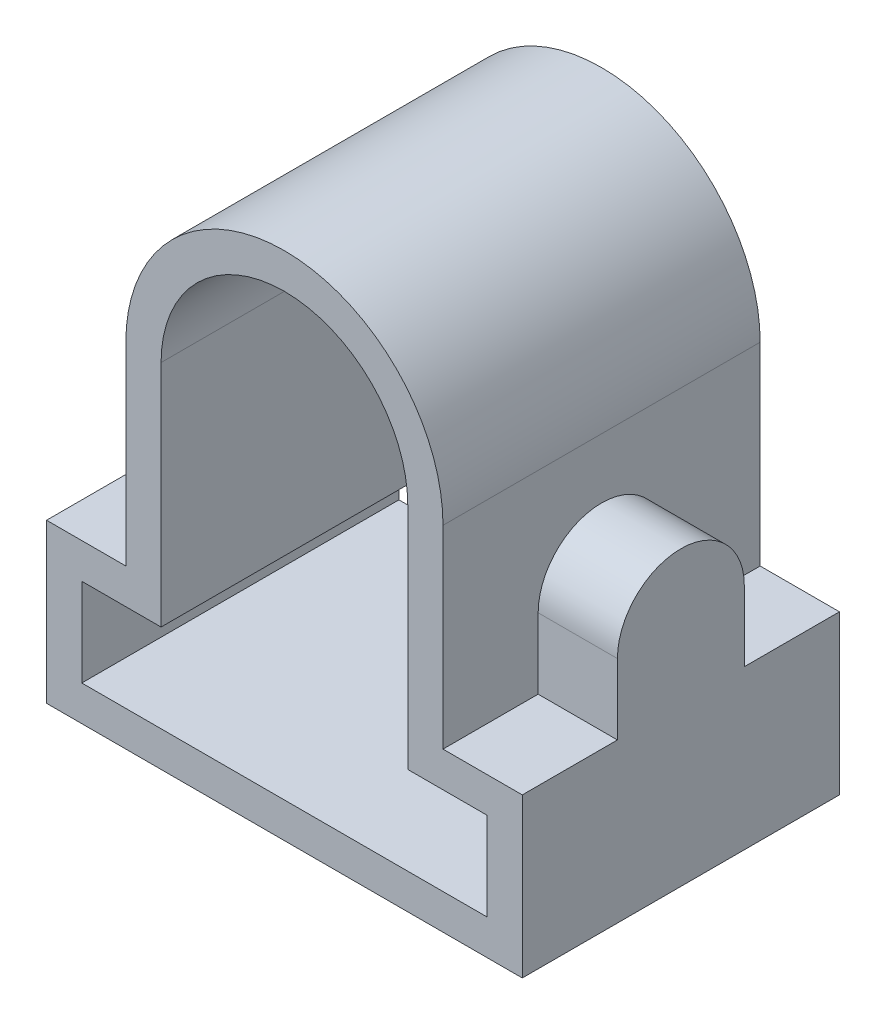
ISO-10303-21;
HEADER;
FILE_DESCRIPTION(('STEP AP214'),'2;1');
FILE_NAME('part.step','',(''),(''),'','','');
FILE_SCHEMA(('AUTOMOTIVE_DESIGN { 1 0 10303 214 1 1 1 1 }'));
ENDSEC;
DATA;
#1=APPLICATION_CONTEXT('core data for automotive mechanical design processes');
#2=APPLICATION_PROTOCOL_DEFINITION('international standard','automotive_design',2000,#1);
#3=PRODUCT_CONTEXT('',#1,'mechanical');
#4=PRODUCT('Part','Part','',(#3));
#5=PRODUCT_RELATED_PRODUCT_CATEGORY('part','',(#4));
#6=PRODUCT_DEFINITION_FORMATION('','',#4);
#7=PRODUCT_DEFINITION_CONTEXT('part definition',#1,'design');
#8=PRODUCT_DEFINITION('design','',#6,#7);
#9=PRODUCT_DEFINITION_SHAPE('','',#8);
#10=(LENGTH_UNIT() NAMED_UNIT(*) SI_UNIT(.MILLI.,.METRE.));
#11=(NAMED_UNIT(*) PLANE_ANGLE_UNIT() SI_UNIT($,.RADIAN.));
#12=(NAMED_UNIT(*) SI_UNIT($,.STERADIAN.) SOLID_ANGLE_UNIT());
#13=UNCERTAINTY_MEASURE_WITH_UNIT(LENGTH_MEASURE(1.E-05),#10,'distance_accuracy_value','');
#14=(GEOMETRIC_REPRESENTATION_CONTEXT(3) GLOBAL_UNCERTAINTY_ASSIGNED_CONTEXT((#13)) GLOBAL_UNIT_ASSIGNED_CONTEXT((#10,
#11,#12)) REPRESENTATION_CONTEXT('',''));
#15=CARTESIAN_POINT('',(0.,0.,0.));
#16=DIRECTION('',(0.,0.,1.));
#17=DIRECTION('',(1.,0.,0.));
#18=AXIS2_PLACEMENT_3D('',#15,#16,#17);
#19=CARTESIAN_POINT('',(67.5,45.,-45.));
#20=DIRECTION('',(0.,1.,0.));
#21=DIRECTION('',(0.,0.,1.));
#22=AXIS2_PLACEMENT_3D('',#19,#20,#21);
#23=PLANE('',#22);
#24=DIRECTION('',(0.,0.,1.));
#25=VECTOR('',#24,1.);
#26=CARTESIAN_POINT('',(45.,45.,-45.));
#27=LINE('',#26,#25);
#28=CARTESIAN_POINT('',(45.,45.,-45.));
#29=VERTEX_POINT('',#28);
#30=CARTESIAN_POINT('',(45.,45.,-18.));
#31=VERTEX_POINT('',#30);
#32=EDGE_CURVE('E326',#29,#31,#27,.T.);
#33=ORIENTED_EDGE('',*,*,#32,.T.);
#34=DIRECTION('',(1.,0.,0.));
#35=VECTOR('',#34,1.);
#36=CARTESIAN_POINT('',(35.5,45.,-18.));
#37=LINE('',#36,#35);
#38=CARTESIAN_POINT('',(67.5,45.,-18.));
#39=VERTEX_POINT('',#38);
#40=EDGE_CURVE('E65',#31,#39,#37,.T.);
#41=ORIENTED_EDGE('',*,*,#40,.T.);
#42=DIRECTION('',(0.,0.,1.));
#43=VECTOR('',#42,1.);
#44=CARTESIAN_POINT('',(67.5,45.,-45.));
#45=LINE('',#44,#43);
#46=CARTESIAN_POINT('',(67.5,45.,-45.));
#47=VERTEX_POINT('',#46);
#48=EDGE_CURVE('E335',#47,#39,#45,.T.);
#49=ORIENTED_EDGE('',*,*,#48,.F.);
#50=DIRECTION('',(-1.,0.,0.));
#51=VECTOR('',#50,1.);
#52=CARTESIAN_POINT('',(67.5,45.,-45.));
#53=LINE('',#52,#51);
#54=EDGE_CURVE('E293',#47,#29,#53,.T.);
#55=ORIENTED_EDGE('',*,*,#54,.T.);
#56=EDGE_LOOP('',(#33,#41,#49,#55));
#57=FACE_BOUND('',#56,.T.);
#58=ADVANCED_FACE('F39',(#57),#23,.T.);
#59=CARTESIAN_POINT('',(67.5,0.,-45.));
#60=DIRECTION('',(1.,0.,0.));
#61=DIRECTION('',(0.,0.,-1.));
#62=AXIS2_PLACEMENT_3D('',#59,#60,#61);
#63=PLANE('',#62);
#64=ORIENTED_EDGE('',*,*,#48,.T.);
#65=DIRECTION('',(0.,1.,0.));
#66=VECTOR('',#65,1.);
#67=CARTESIAN_POINT('',(67.5,65.,-18.));
#68=LINE('',#67,#66);
#69=CARTESIAN_POINT('',(67.5,65.,-18.));
#70=VERTEX_POINT('',#69);
#71=EDGE_CURVE('E188',#39,#70,#68,.T.);
#72=ORIENTED_EDGE('',*,*,#71,.T.);
#73=CARTESIAN_POINT('',(67.5,65.,0.));
#74=DIRECTION('',(1.,0.,0.));
#75=DIRECTION('',(0.,0.,-1.));
#76=AXIS2_PLACEMENT_3D('',#73,#74,#75);
#77=CIRCLE('',#76,18.);
#78=CARTESIAN_POINT('',(67.5,65.,18.));
#79=VERTEX_POINT('',#78);
#80=EDGE_CURVE('E182',#70,#79,#77,.T.);
#81=ORIENTED_EDGE('',*,*,#80,.T.);
#82=DIRECTION('',(0.,-1.,0.));
#83=VECTOR('',#82,1.);
#84=CARTESIAN_POINT('',(67.5,65.,18.));
#85=LINE('',#84,#83);
#86=CARTESIAN_POINT('',(67.5,45.,18.));
#87=VERTEX_POINT('',#86);
#88=EDGE_CURVE('E195',#79,#87,#85,.T.);
#89=ORIENTED_EDGE('',*,*,#88,.T.);
#90=CARTESIAN_POINT('',(67.5,45.,45.));
#91=VERTEX_POINT('',#90);
#92=EDGE_CURVE('E53',#87,#91,#45,.T.);
#93=ORIENTED_EDGE('',*,*,#92,.T.);
#94=DIRECTION('',(0.,1.,0.));
#95=VECTOR('',#94,1.);
#96=CARTESIAN_POINT('',(67.5,0.,45.));
#97=LINE('',#96,#95);
#98=CARTESIAN_POINT('',(67.5,0.,45.));
#99=VERTEX_POINT('',#98);
#100=EDGE_CURVE('E228',#99,#91,#97,.T.);
#101=ORIENTED_EDGE('',*,*,#100,.F.);
#102=DIRECTION('',(0.,0.,1.));
#103=VECTOR('',#102,1.);
#104=CARTESIAN_POINT('',(67.5,0.,-45.));
#105=LINE('',#104,#103);
#106=CARTESIAN_POINT('',(67.5,0.,-45.));
#107=VERTEX_POINT('',#106);
#108=EDGE_CURVE('E316',#107,#99,#105,.T.);
#109=ORIENTED_EDGE('',*,*,#108,.F.);
#110=DIRECTION('',(0.,1.,0.));
#111=VECTOR('',#110,1.);
#112=CARTESIAN_POINT('',(67.5,0.,-45.));
#113=LINE('',#112,#111);
#114=EDGE_CURVE('E278',#107,#47,#113,.T.);
#115=ORIENTED_EDGE('',*,*,#114,.T.);
#116=EDGE_LOOP('',(#64,#72,#81,#89,#93,#101,#109,#115));
#117=FACE_BOUND('',#116,.T.);
#118=ADVANCED_FACE('F41',(#117),#63,.T.);
#119=CARTESIAN_POINT('',(-67.5,0.,-45.));
#120=DIRECTION('',(0.,-1.,0.));
#121=DIRECTION('',(0.,0.,-1.));
#122=AXIS2_PLACEMENT_3D('',#119,#120,#121);
#123=PLANE('',#122);
#124=ORIENTED_EDGE('',*,*,#108,.T.);
#125=DIRECTION('',(1.,0.,0.));
#126=VECTOR('',#125,1.);
#127=CARTESIAN_POINT('',(-67.5,0.,45.));
#128=LINE('',#127,#126);
#129=CARTESIAN_POINT('',(-67.5,0.,45.));
#130=VERTEX_POINT('',#129);
#131=EDGE_CURVE('E249',#130,#99,#128,.T.);
#132=ORIENTED_EDGE('',*,*,#131,.F.);
#133=DIRECTION('',(0.,0.,1.));
#134=VECTOR('',#133,1.);
#135=CARTESIAN_POINT('',(-67.5,0.,-45.));
#136=LINE('',#135,#134);
#137=CARTESIAN_POINT('',(-67.5,0.,-45.));
#138=VERTEX_POINT('',#137);
#139=EDGE_CURVE('E317',#138,#130,#136,.T.);
#140=ORIENTED_EDGE('',*,*,#139,.F.);
#141=DIRECTION('',(1.,0.,0.));
#142=VECTOR('',#141,1.);
#143=CARTESIAN_POINT('',(-67.5,0.,-45.));
#144=LINE('',#143,#142);
#145=EDGE_CURVE('E313',#138,#107,#144,.T.);
#146=ORIENTED_EDGE('',*,*,#145,.T.);
#147=EDGE_LOOP('',(#124,#132,#140,#146));
#148=FACE_BOUND('',#147,.T.);
#149=ADVANCED_FACE('F352',(#148),#123,.T.);
#150=CARTESIAN_POINT('',(-67.5,0.,-45.));
#151=DIRECTION('',(-1.,0.,0.));
#152=DIRECTION('',(0.,0.,1.));
#153=AXIS2_PLACEMENT_3D('',#150,#151,#152);
#154=PLANE('',#153);
#155=ORIENTED_EDGE('',*,*,#139,.T.);
#156=DIRECTION('',(0.,-1.,0.));
#157=VECTOR('',#156,1.);
#158=CARTESIAN_POINT('',(-67.5,0.,45.));
#159=LINE('',#158,#157);
#160=CARTESIAN_POINT('',(-67.5,45.,45.));
#161=VERTEX_POINT('',#160);
#162=EDGE_CURVE('E247',#161,#130,#159,.T.);
#163=ORIENTED_EDGE('',*,*,#162,.F.);
#164=DIRECTION('',(0.,0.,1.));
#165=VECTOR('',#164,1.);
#166=CARTESIAN_POINT('',(-67.5,45.,-45.));
#167=LINE('',#166,#165);
#168=CARTESIAN_POINT('',(-67.5,45.,-45.));
#169=VERTEX_POINT('',#168);
#170=EDGE_CURVE('E321',#169,#161,#167,.T.);
#171=ORIENTED_EDGE('',*,*,#170,.F.);
#172=DIRECTION('',(0.,-1.,0.));
#173=VECTOR('',#172,1.);
#174=CARTESIAN_POINT('',(-67.5,0.,-45.));
#175=LINE('',#174,#173);
#176=EDGE_CURVE('E307',#169,#138,#175,.T.);
#177=ORIENTED_EDGE('',*,*,#176,.T.);
#178=EDGE_LOOP('',(#155,#163,#171,#177));
#179=FACE_BOUND('',#178,.T.);
#180=ADVANCED_FACE('F402',(#179),#154,.T.);
#181=CARTESIAN_POINT('',(-67.5,45.,-45.));
#182=DIRECTION('',(0.,1.,0.));
#183=DIRECTION('',(0.,0.,1.));
#184=AXIS2_PLACEMENT_3D('',#181,#182,#183);
#185=PLANE('',#184);
#186=ORIENTED_EDGE('',*,*,#170,.T.);
#187=DIRECTION('',(-1.,0.,0.));
#188=VECTOR('',#187,1.);
#189=CARTESIAN_POINT('',(-67.5,45.,45.));
#190=LINE('',#189,#188);
#191=CARTESIAN_POINT('',(-45.,45.,45.));
#192=VERTEX_POINT('',#191);
#193=EDGE_CURVE('E241',#192,#161,#190,.T.);
#194=ORIENTED_EDGE('',*,*,#193,.F.);
#195=DIRECTION('',(0.,0.,1.));
#196=VECTOR('',#195,1.);
#197=CARTESIAN_POINT('',(-45.,45.,-45.));
#198=LINE('',#197,#196);
#199=CARTESIAN_POINT('',(-45.,45.,-45.));
#200=VERTEX_POINT('',#199);
#201=EDGE_CURVE('E322',#200,#192,#198,.T.);
#202=ORIENTED_EDGE('',*,*,#201,.F.);
#203=DIRECTION('',(-1.,0.,0.));
#204=VECTOR('',#203,1.);
#205=CARTESIAN_POINT('',(-67.5,45.,-45.));
#206=LINE('',#205,#204);
#207=EDGE_CURVE('E310',#200,#169,#206,.T.);
#208=ORIENTED_EDGE('',*,*,#207,.T.);
#209=EDGE_LOOP('',(#186,#194,#202,#208));
#210=FACE_BOUND('',#209,.T.);
#211=ADVANCED_FACE('F408',(#210),#185,.T.);
#212=CARTESIAN_POINT('',(-45.,45.,-45.));
#213=DIRECTION('',(-1.,0.,0.));
#214=DIRECTION('',(0.,0.,1.));
#215=AXIS2_PLACEMENT_3D('',#212,#213,#214);
#216=PLANE('',#215);
#217=ORIENTED_EDGE('',*,*,#201,.T.);
#218=DIRECTION('',(0.,-1.,0.));
#219=VECTOR('',#218,1.);
#220=CARTESIAN_POINT('',(-45.,45.,45.));
#221=LINE('',#220,#219);
#222=CARTESIAN_POINT('',(-45.,100.,45.));
#223=VERTEX_POINT('',#222);
#224=EDGE_CURVE('E238',#223,#192,#221,.T.);
#225=ORIENTED_EDGE('',*,*,#224,.F.);
#226=DIRECTION('',(0.,0.,1.));
#227=VECTOR('',#226,1.);
#228=CARTESIAN_POINT('',(-45.,100.,-45.));
#229=LINE('',#228,#227);
#230=CARTESIAN_POINT('',(-45.,100.,-45.));
#231=VERTEX_POINT('',#230);
#232=EDGE_CURVE('E324',#231,#223,#229,.T.);
#233=ORIENTED_EDGE('',*,*,#232,.F.);
#234=DIRECTION('',(0.,-1.,0.));
#235=VECTOR('',#234,1.);
#236=CARTESIAN_POINT('',(-45.,45.,-45.));
#237=LINE('',#236,#235);
#238=EDGE_CURVE('E305',#231,#200,#237,.T.);
#239=ORIENTED_EDGE('',*,*,#238,.T.);
#240=EDGE_LOOP('',(#217,#225,#233,#239));
#241=FACE_BOUND('',#240,.T.);
#242=ADVANCED_FACE('F415',(#241),#216,.T.);
#243=CARTESIAN_POINT('',(0.,100.,-45.));
#244=DIRECTION('',(0.,0.,1.));
#245=DIRECTION('',(1.,0.,0.));
#246=AXIS2_PLACEMENT_3D('',#243,#244,#245);
#247=CYLINDRICAL_SURFACE('',#246,45.);
#248=ORIENTED_EDGE('',*,*,#232,.T.);
#249=CARTESIAN_POINT('',(0.,100.,45.));
#250=DIRECTION('',(0.,0.,1.));
#251=DIRECTION('',(1.,0.,0.));
#252=AXIS2_PLACEMENT_3D('',#249,#250,#251);
#253=CIRCLE('',#252,45.);
#254=CARTESIAN_POINT('',(45.,100.,45.));
#255=VERTEX_POINT('',#254);
#256=EDGE_CURVE('E240',#255,#223,#253,.T.);
#257=ORIENTED_EDGE('',*,*,#256,.F.);
#258=DIRECTION('',(0.,0.,1.));
#259=VECTOR('',#258,1.);
#260=CARTESIAN_POINT('',(45.,100.,-45.));
#261=LINE('',#260,#259);
#262=CARTESIAN_POINT('',(45.,100.,-45.));
#263=VERTEX_POINT('',#262);
#264=EDGE_CURVE('E330',#263,#255,#261,.T.);
#265=ORIENTED_EDGE('',*,*,#264,.F.);
#266=CARTESIAN_POINT('',(0.,100.,-45.));
#267=DIRECTION('',(0.,0.,1.));
#268=DIRECTION('',(1.,0.,0.));
#269=AXIS2_PLACEMENT_3D('',#266,#267,#268);
#270=CIRCLE('',#269,45.);
#271=EDGE_CURVE('E303',#263,#231,#270,.T.);
#272=ORIENTED_EDGE('',*,*,#271,.T.);
#273=EDGE_LOOP('',(#248,#257,#265,#272));
#274=FACE_BOUND('',#273,.T.);
#275=ADVANCED_FACE('F346',(#274),#247,.T.);
#276=CARTESIAN_POINT('',(45.,45.,-45.));
#277=DIRECTION('',(1.,0.,0.));
#278=DIRECTION('',(0.,0.,-1.));
#279=AXIS2_PLACEMENT_3D('',#276,#277,#278);
#280=PLANE('',#279);
#281=DIRECTION('',(0.,1.,0.));
#282=VECTOR('',#281,1.);
#283=CARTESIAN_POINT('',(45.,45.,-18.));
#284=LINE('',#283,#282);
#285=CARTESIAN_POINT('',(45.,65.,-18.));
#286=VERTEX_POINT('',#285);
#287=EDGE_CURVE('E11',#31,#286,#284,.T.);
#288=ORIENTED_EDGE('',*,*,#287,.F.);
#289=ORIENTED_EDGE('',*,*,#32,.F.);
#290=DIRECTION('',(0.,1.,0.));
#291=VECTOR('',#290,1.);
#292=CARTESIAN_POINT('',(45.,45.,-45.));
#293=LINE('',#292,#291);
#294=EDGE_CURVE('E296',#29,#263,#293,.T.);
#295=ORIENTED_EDGE('',*,*,#294,.T.);
#296=ORIENTED_EDGE('',*,*,#264,.T.);
#297=DIRECTION('',(0.,1.,0.));
#298=VECTOR('',#297,1.);
#299=CARTESIAN_POINT('',(45.,45.,45.));
#300=LINE('',#299,#298);
#301=CARTESIAN_POINT('',(45.,45.,45.));
#302=VERTEX_POINT('',#301);
#303=EDGE_CURVE('E233',#302,#255,#300,.T.);
#304=ORIENTED_EDGE('',*,*,#303,.F.);
#305=CARTESIAN_POINT('',(45.,45.,18.));
#306=VERTEX_POINT('',#305);
#307=EDGE_CURVE('E333',#306,#302,#27,.T.);
#308=ORIENTED_EDGE('',*,*,#307,.F.);
#309=DIRECTION('',(0.,-1.,0.));
#310=VECTOR('',#309,1.);
#311=CARTESIAN_POINT('',(45.,45.,18.));
#312=LINE('',#311,#310);
#313=CARTESIAN_POINT('',(45.,65.,18.));
#314=VERTEX_POINT('',#313);
#315=EDGE_CURVE('E318',#314,#306,#312,.T.);
#316=ORIENTED_EDGE('',*,*,#315,.F.);
#317=CARTESIAN_POINT('',(45.,65.,0.));
#318=DIRECTION('',(1.,0.,0.));
#319=DIRECTION('',(0.,0.,-1.));
#320=AXIS2_PLACEMENT_3D('',#317,#318,#319);
#321=CIRCLE('',#320,18.);
#322=EDGE_CURVE('E50',#286,#314,#321,.T.);
#323=ORIENTED_EDGE('',*,*,#322,.F.);
#324=EDGE_LOOP('',(#288,#289,#295,#296,#304,#308,#316,#323));
#325=FACE_BOUND('',#324,.T.);
#326=ADVANCED_FACE('F334',(#325),#280,.T.);
#327=DIRECTION('',(1.,0.,0.));
#328=VECTOR('',#327,1.);
#329=CARTESIAN_POINT('',(35.5,45.,18.));
#330=LINE('',#329,#328);
#331=EDGE_CURVE('E187',#306,#87,#330,.T.);
#332=ORIENTED_EDGE('',*,*,#331,.F.);
#333=ORIENTED_EDGE('',*,*,#307,.T.);
#334=DIRECTION('',(-1.,0.,0.));
#335=VECTOR('',#334,1.);
#336=CARTESIAN_POINT('',(67.5,45.,45.));
#337=LINE('',#336,#335);
#338=EDGE_CURVE('E231',#91,#302,#337,.T.);
#339=ORIENTED_EDGE('',*,*,#338,.F.);
#340=ORIENTED_EDGE('',*,*,#92,.F.);
#341=EDGE_LOOP('',(#332,#333,#339,#340));
#342=FACE_BOUND('',#341,.T.);
#343=ADVANCED_FACE('F340',(#342),#23,.T.);
#344=CARTESIAN_POINT('',(0.,100.,-45.));
#345=DIRECTION('',(0.,0.,1.));
#346=DIRECTION('',(1.,0.,0.));
#347=AXIS2_PLACEMENT_3D('',#344,#345,#346);
#348=PLANE('',#347);
#349=DIRECTION('',(0.,1.,0.));
#350=VECTOR('',#349,1.);
#351=CARTESIAN_POINT('',(57.5,10.,-45.));
#352=LINE('',#351,#350);
#353=CARTESIAN_POINT('',(57.5,10.,-45.));
#354=VERTEX_POINT('',#353);
#355=CARTESIAN_POINT('',(57.5,35.,-45.));
#356=VERTEX_POINT('',#355);
#357=EDGE_CURVE('E273',#354,#356,#352,.T.);
#358=ORIENTED_EDGE('',*,*,#357,.T.);
#359=DIRECTION('',(-1.,0.,0.));
#360=VECTOR('',#359,1.);
#361=CARTESIAN_POINT('',(57.5,35.,-45.));
#362=LINE('',#361,#360);
#363=CARTESIAN_POINT('',(35.,35.,-45.));
#364=VERTEX_POINT('',#363);
#365=EDGE_CURVE('E255',#356,#364,#362,.T.);
#366=ORIENTED_EDGE('',*,*,#365,.T.);
#367=DIRECTION('',(0.,1.,0.));
#368=VECTOR('',#367,1.);
#369=CARTESIAN_POINT('',(35.,35.,-45.));
#370=LINE('',#369,#368);
#371=CARTESIAN_POINT('',(35.,100.,-45.));
#372=VERTEX_POINT('',#371);
#373=EDGE_CURVE('E254',#364,#372,#370,.T.);
#374=ORIENTED_EDGE('',*,*,#373,.T.);
#375=CARTESIAN_POINT('',(0.,100.,-45.));
#376=DIRECTION('',(0.,0.,1.));
#377=DIRECTION('',(1.,0.,0.));
#378=AXIS2_PLACEMENT_3D('',#375,#376,#377);
#379=CIRCLE('',#378,35.);
#380=CARTESIAN_POINT('',(-35.,100.,-45.));
#381=VERTEX_POINT('',#380);
#382=EDGE_CURVE('E256',#372,#381,#379,.T.);
#383=ORIENTED_EDGE('',*,*,#382,.T.);
#384=DIRECTION('',(0.,-1.,0.));
#385=VECTOR('',#384,1.);
#386=CARTESIAN_POINT('',(-35.,35.,-45.));
#387=LINE('',#386,#385);
#388=CARTESIAN_POINT('',(-35.,35.,-45.));
#389=VERTEX_POINT('',#388);
#390=EDGE_CURVE('E263',#381,#389,#387,.T.);
#391=ORIENTED_EDGE('',*,*,#390,.T.);
#392=DIRECTION('',(-1.,0.,0.));
#393=VECTOR('',#392,1.);
#394=CARTESIAN_POINT('',(-57.5,35.,-45.));
#395=LINE('',#394,#393);
#396=CARTESIAN_POINT('',(-57.5,35.,-45.));
#397=VERTEX_POINT('',#396);
#398=EDGE_CURVE('E264',#389,#397,#395,.T.);
#399=ORIENTED_EDGE('',*,*,#398,.T.);
#400=DIRECTION('',(0.,-1.,0.));
#401=VECTOR('',#400,1.);
#402=CARTESIAN_POINT('',(-57.5,10.,-45.));
#403=LINE('',#402,#401);
#404=CARTESIAN_POINT('',(-57.5,10.,-45.));
#405=VERTEX_POINT('',#404);
#406=EDGE_CURVE('E270',#397,#405,#403,.T.);
#407=ORIENTED_EDGE('',*,*,#406,.T.);
#408=DIRECTION('',(1.,0.,0.));
#409=VECTOR('',#408,1.);
#410=CARTESIAN_POINT('',(-57.5,10.,-45.));
#411=LINE('',#410,#409);
#412=EDGE_CURVE('E269',#405,#354,#411,.T.);
#413=ORIENTED_EDGE('',*,*,#412,.T.);
#414=EDGE_LOOP('',(#358,#366,#374,#383,#391,#399,#407,#413));
#415=FACE_BOUND('',#414,.T.);
#416=ORIENTED_EDGE('',*,*,#114,.F.);
#417=ORIENTED_EDGE('',*,*,#145,.F.);
#418=ORIENTED_EDGE('',*,*,#176,.F.);
#419=ORIENTED_EDGE('',*,*,#207,.F.);
#420=ORIENTED_EDGE('',*,*,#238,.F.);
#421=ORIENTED_EDGE('',*,*,#271,.F.);
#422=ORIENTED_EDGE('',*,*,#294,.F.);
#423=ORIENTED_EDGE('',*,*,#54,.F.);
#424=EDGE_LOOP('',(#416,#417,#418,#419,#420,#421,#422,#423));
#425=FACE_BOUND('',#424,.T.);
#426=ADVANCED_FACE('F339',(#415,#425),#348,.F.);
#427=CARTESIAN_POINT('',(57.5,35.,-45.));
#428=DIRECTION('',(0.,1.,0.));
#429=DIRECTION('',(0.,0.,1.));
#430=AXIS2_PLACEMENT_3D('',#427,#428,#429);
#431=PLANE('',#430);
#432=DIRECTION('',(0.,0.,1.));
#433=VECTOR('',#432,1.);
#434=CARTESIAN_POINT('',(57.5,35.,-45.));
#435=LINE('',#434,#433);
#436=CARTESIAN_POINT('',(57.5,35.,45.));
#437=VERTEX_POINT('',#436);
#438=EDGE_CURVE('E280',#356,#437,#435,.T.);
#439=ORIENTED_EDGE('',*,*,#438,.T.);
#440=DIRECTION('',(-1.,0.,0.));
#441=VECTOR('',#440,1.);
#442=CARTESIAN_POINT('',(57.5,35.,45.));
#443=LINE('',#442,#441);
#444=CARTESIAN_POINT('',(35.,35.,45.));
#445=VERTEX_POINT('',#444);
#446=EDGE_CURVE('E205',#437,#445,#443,.T.);
#447=ORIENTED_EDGE('',*,*,#446,.T.);
#448=DIRECTION('',(0.,0.,1.));
#449=VECTOR('',#448,1.);
#450=CARTESIAN_POINT('',(35.,35.,-45.));
#451=LINE('',#450,#449);
#452=EDGE_CURVE('E276',#364,#445,#451,.T.);
#453=ORIENTED_EDGE('',*,*,#452,.F.);
#454=ORIENTED_EDGE('',*,*,#365,.F.);
#455=EDGE_LOOP('',(#439,#447,#453,#454));
#456=FACE_BOUND('',#455,.T.);
#457=ADVANCED_FACE('F344',(#456),#431,.F.);
#458=CARTESIAN_POINT('',(57.5,10.,-45.));
#459=DIRECTION('',(1.,0.,0.));
#460=DIRECTION('',(0.,0.,-1.));
#461=AXIS2_PLACEMENT_3D('',#458,#459,#460);
#462=PLANE('',#461);
#463=DIRECTION('',(0.,0.,1.));
#464=VECTOR('',#463,1.);
#465=CARTESIAN_POINT('',(57.5,10.,-45.));
#466=LINE('',#465,#464);
#467=CARTESIAN_POINT('',(57.5,10.,45.));
#468=VERTEX_POINT('',#467);
#469=EDGE_CURVE('E279',#354,#468,#466,.T.);
#470=ORIENTED_EDGE('',*,*,#469,.T.);
#471=DIRECTION('',(0.,1.,0.));
#472=VECTOR('',#471,1.);
#473=CARTESIAN_POINT('',(57.5,10.,45.));
#474=LINE('',#473,#472);
#475=EDGE_CURVE('E224',#468,#437,#474,.T.);
#476=ORIENTED_EDGE('',*,*,#475,.T.);
#477=ORIENTED_EDGE('',*,*,#438,.F.);
#478=ORIENTED_EDGE('',*,*,#357,.F.);
#479=EDGE_LOOP('',(#470,#476,#477,#478));
#480=FACE_BOUND('',#479,.T.);
#481=ADVANCED_FACE('F375',(#480),#462,.F.);
#482=CARTESIAN_POINT('',(-57.5,10.,-45.));
#483=DIRECTION('',(0.,-1.,0.));
#484=DIRECTION('',(0.,0.,-1.));
#485=AXIS2_PLACEMENT_3D('',#482,#483,#484);
#486=PLANE('',#485);
#487=DIRECTION('',(0.,0.,1.));
#488=VECTOR('',#487,1.);
#489=CARTESIAN_POINT('',(-57.5,10.,-45.));
#490=LINE('',#489,#488);
#491=CARTESIAN_POINT('',(-57.5,10.,45.));
#492=VERTEX_POINT('',#491);
#493=EDGE_CURVE('E285',#405,#492,#490,.T.);
#494=ORIENTED_EDGE('',*,*,#493,.T.);
#495=DIRECTION('',(1.,0.,0.));
#496=VECTOR('',#495,1.);
#497=CARTESIAN_POINT('',(-57.5,10.,45.));
#498=LINE('',#497,#496);
#499=EDGE_CURVE('E225',#492,#468,#498,.T.);
#500=ORIENTED_EDGE('',*,*,#499,.T.);
#501=ORIENTED_EDGE('',*,*,#469,.F.);
#502=ORIENTED_EDGE('',*,*,#412,.F.);
#503=EDGE_LOOP('',(#494,#500,#501,#502));
#504=FACE_BOUND('',#503,.T.);
#505=ADVANCED_FACE('F373',(#504),#486,.F.);
#506=CARTESIAN_POINT('',(-57.5,10.,-45.));
#507=DIRECTION('',(-1.,0.,0.));
#508=DIRECTION('',(0.,0.,1.));
#509=AXIS2_PLACEMENT_3D('',#506,#507,#508);
#510=PLANE('',#509);
#511=DIRECTION('',(0.,0.,1.));
#512=VECTOR('',#511,1.);
#513=CARTESIAN_POINT('',(-57.5,35.,-45.));
#514=LINE('',#513,#512);
#515=CARTESIAN_POINT('',(-57.5,35.,45.));
#516=VERTEX_POINT('',#515);
#517=EDGE_CURVE('E281',#397,#516,#514,.T.);
#518=ORIENTED_EDGE('',*,*,#517,.T.);
#519=DIRECTION('',(0.,-1.,0.));
#520=VECTOR('',#519,1.);
#521=CARTESIAN_POINT('',(-57.5,10.,45.));
#522=LINE('',#521,#520);
#523=EDGE_CURVE('E219',#516,#492,#522,.T.);
#524=ORIENTED_EDGE('',*,*,#523,.T.);
#525=ORIENTED_EDGE('',*,*,#493,.F.);
#526=ORIENTED_EDGE('',*,*,#406,.F.);
#527=EDGE_LOOP('',(#518,#524,#525,#526));
#528=FACE_BOUND('',#527,.T.);
#529=ADVANCED_FACE('F377',(#528),#510,.F.);
#530=CARTESIAN_POINT('',(-57.5,35.,-45.));
#531=DIRECTION('',(0.,1.,0.));
#532=DIRECTION('',(0.,0.,1.));
#533=AXIS2_PLACEMENT_3D('',#530,#531,#532);
#534=PLANE('',#533);
#535=DIRECTION('',(0.,0.,1.));
#536=VECTOR('',#535,1.);
#537=CARTESIAN_POINT('',(-35.,35.,-45.));
#538=LINE('',#537,#536);
#539=CARTESIAN_POINT('',(-35.,35.,45.));
#540=VERTEX_POINT('',#539);
#541=EDGE_CURVE('E288',#389,#540,#538,.T.);
#542=ORIENTED_EDGE('',*,*,#541,.T.);
#543=DIRECTION('',(-1.,0.,0.));
#544=VECTOR('',#543,1.);
#545=CARTESIAN_POINT('',(-57.5,35.,45.));
#546=LINE('',#545,#544);
#547=EDGE_CURVE('E218',#540,#516,#546,.T.);
#548=ORIENTED_EDGE('',*,*,#547,.T.);
#549=ORIENTED_EDGE('',*,*,#517,.F.);
#550=ORIENTED_EDGE('',*,*,#398,.F.);
#551=EDGE_LOOP('',(#542,#548,#549,#550));
#552=FACE_BOUND('',#551,.T.);
#553=ADVANCED_FACE('F381',(#552),#534,.F.);
#554=CARTESIAN_POINT('',(-35.,35.,-45.));
#555=DIRECTION('',(-1.,0.,0.));
#556=DIRECTION('',(0.,0.,1.));
#557=AXIS2_PLACEMENT_3D('',#554,#555,#556);
#558=PLANE('',#557);
#559=DIRECTION('',(0.,0.,1.));
#560=VECTOR('',#559,1.);
#561=CARTESIAN_POINT('',(-35.,100.,-45.));
#562=LINE('',#561,#560);
#563=CARTESIAN_POINT('',(-35.,100.,45.));
#564=VERTEX_POINT('',#563);
#565=EDGE_CURVE('E286',#381,#564,#562,.T.);
#566=ORIENTED_EDGE('',*,*,#565,.T.);
#567=DIRECTION('',(0.,-1.,0.));
#568=VECTOR('',#567,1.);
#569=CARTESIAN_POINT('',(-35.,35.,45.));
#570=LINE('',#569,#568);
#571=EDGE_CURVE('E211',#564,#540,#570,.T.);
#572=ORIENTED_EDGE('',*,*,#571,.T.);
#573=ORIENTED_EDGE('',*,*,#541,.F.);
#574=ORIENTED_EDGE('',*,*,#390,.F.);
#575=EDGE_LOOP('',(#566,#572,#573,#574));
#576=FACE_BOUND('',#575,.T.);
#577=ADVANCED_FACE('F390',(#576),#558,.F.);
#578=CARTESIAN_POINT('',(0.,100.,-45.));
#579=DIRECTION('',(0.,0.,1.));
#580=DIRECTION('',(1.,0.,0.));
#581=AXIS2_PLACEMENT_3D('',#578,#579,#580);
#582=CYLINDRICAL_SURFACE('',#581,35.);
#583=DIRECTION('',(0.,0.,1.));
#584=VECTOR('',#583,1.);
#585=CARTESIAN_POINT('',(35.,100.,-45.));
#586=LINE('',#585,#584);
#587=CARTESIAN_POINT('',(35.,100.,45.));
#588=VERTEX_POINT('',#587);
#589=EDGE_CURVE('E289',#372,#588,#586,.T.);
#590=ORIENTED_EDGE('',*,*,#589,.T.);
#591=CARTESIAN_POINT('',(0.,100.,45.));
#592=DIRECTION('',(0.,0.,1.));
#593=DIRECTION('',(1.,0.,0.));
#594=AXIS2_PLACEMENT_3D('',#591,#592,#593);
#595=CIRCLE('',#594,35.);
#596=EDGE_CURVE('E209',#588,#564,#595,.T.);
#597=ORIENTED_EDGE('',*,*,#596,.T.);
#598=ORIENTED_EDGE('',*,*,#565,.F.);
#599=ORIENTED_EDGE('',*,*,#382,.F.);
#600=EDGE_LOOP('',(#590,#597,#598,#599));
#601=FACE_BOUND('',#600,.T.);
#602=ADVANCED_FACE('F393',(#601),#582,.F.);
#603=CARTESIAN_POINT('',(35.,35.,-45.));
#604=DIRECTION('',(1.,0.,0.));
#605=DIRECTION('',(0.,0.,-1.));
#606=AXIS2_PLACEMENT_3D('',#603,#604,#605);
#607=PLANE('',#606);
#608=ORIENTED_EDGE('',*,*,#452,.T.);
#609=DIRECTION('',(0.,1.,0.));
#610=VECTOR('',#609,1.);
#611=CARTESIAN_POINT('',(35.,35.,45.));
#612=LINE('',#611,#610);
#613=EDGE_CURVE('E210',#445,#588,#612,.T.);
#614=ORIENTED_EDGE('',*,*,#613,.T.);
#615=ORIENTED_EDGE('',*,*,#589,.F.);
#616=ORIENTED_EDGE('',*,*,#373,.F.);
#617=EDGE_LOOP('',(#608,#614,#615,#616));
#618=FACE_BOUND('',#617,.T.);
#619=ADVANCED_FACE('F369',(#618),#607,.F.);
#620=CARTESIAN_POINT('',(0.,100.,45.));
#621=DIRECTION('',(0.,0.,1.));
#622=DIRECTION('',(1.,0.,0.));
#623=AXIS2_PLACEMENT_3D('',#620,#621,#622);
#624=PLANE('',#623);
#625=ORIENTED_EDGE('',*,*,#100,.T.);
#626=ORIENTED_EDGE('',*,*,#338,.T.);
#627=ORIENTED_EDGE('',*,*,#303,.T.);
#628=ORIENTED_EDGE('',*,*,#256,.T.);
#629=ORIENTED_EDGE('',*,*,#224,.T.);
#630=ORIENTED_EDGE('',*,*,#193,.T.);
#631=ORIENTED_EDGE('',*,*,#162,.T.);
#632=ORIENTED_EDGE('',*,*,#131,.T.);
#633=EDGE_LOOP('',(#625,#626,#627,#628,#629,#630,#631,#632));
#634=FACE_BOUND('',#633,.T.);
#635=ORIENTED_EDGE('',*,*,#613,.F.);
#636=ORIENTED_EDGE('',*,*,#446,.F.);
#637=ORIENTED_EDGE('',*,*,#475,.F.);
#638=ORIENTED_EDGE('',*,*,#499,.F.);
#639=ORIENTED_EDGE('',*,*,#523,.F.);
#640=ORIENTED_EDGE('',*,*,#547,.F.);
#641=ORIENTED_EDGE('',*,*,#571,.F.);
#642=ORIENTED_EDGE('',*,*,#596,.F.);
#643=EDGE_LOOP('',(#635,#636,#637,#638,#639,#640,#641,#642));
#644=FACE_BOUND('',#643,.T.);
#645=ADVANCED_FACE('F366',(#634,#644),#624,.T.);
#646=CARTESIAN_POINT('',(35.5,65.,0.));
#647=DIRECTION('',(1.,0.,0.));
#648=DIRECTION('',(0.,0.,-1.));
#649=AXIS2_PLACEMENT_3D('',#646,#647,#648);
#650=CYLINDRICAL_SURFACE('',#649,18.);
#651=DIRECTION('',(1.,0.,0.));
#652=VECTOR('',#651,1.);
#653=CARTESIAN_POINT('',(35.5,65.,-18.));
#654=LINE('',#653,#652);
#655=EDGE_CURVE('E199',#286,#70,#654,.T.);
#656=ORIENTED_EDGE('',*,*,#655,.F.);
#657=ORIENTED_EDGE('',*,*,#322,.T.);
#658=DIRECTION('',(1.,0.,0.));
#659=VECTOR('',#658,1.);
#660=CARTESIAN_POINT('',(35.5,65.,18.));
#661=LINE('',#660,#659);
#662=EDGE_CURVE('E177',#314,#79,#661,.T.);
#663=ORIENTED_EDGE('',*,*,#662,.T.);
#664=ORIENTED_EDGE('',*,*,#80,.F.);
#665=EDGE_LOOP('',(#656,#657,#663,#664));
#666=FACE_BOUND('',#665,.T.);
#667=ADVANCED_FACE('F185',(#666),#650,.T.);
#668=CARTESIAN_POINT('',(35.5,65.,-18.));
#669=DIRECTION('',(0.,0.,-1.));
#670=DIRECTION('',(0.,1.,0.));
#671=AXIS2_PLACEMENT_3D('',#668,#669,#670);
#672=PLANE('',#671);
#673=ORIENTED_EDGE('',*,*,#40,.F.);
#674=ORIENTED_EDGE('',*,*,#287,.T.);
#675=ORIENTED_EDGE('',*,*,#655,.T.);
#676=ORIENTED_EDGE('',*,*,#71,.F.);
#677=EDGE_LOOP('',(#673,#674,#675,#676));
#678=FACE_BOUND('',#677,.T.);
#679=ADVANCED_FACE('F357',(#678),#672,.T.);
#680=CARTESIAN_POINT('',(35.5,65.,18.));
#681=DIRECTION('',(0.,0.,1.));
#682=DIRECTION('',(0.,-1.,0.));
#683=AXIS2_PLACEMENT_3D('',#680,#681,#682);
#684=PLANE('',#683);
#685=ORIENTED_EDGE('',*,*,#662,.F.);
#686=ORIENTED_EDGE('',*,*,#315,.T.);
#687=ORIENTED_EDGE('',*,*,#331,.T.);
#688=ORIENTED_EDGE('',*,*,#88,.F.);
#689=EDGE_LOOP('',(#685,#686,#687,#688));
#690=FACE_BOUND('',#689,.T.);
#691=ADVANCED_FACE('F194',(#690),#684,.T.);
#692=CLOSED_SHELL('',(#58,#118,#149,#180,#211,#242,#275,#326,#343,#426,#457,#481,#505,#529,#553,
#577,#602,#619,#645,#667,#679,#691));
#693=MANIFOLD_SOLID_BREP('B2',#692);
#694=ADVANCED_BREP_SHAPE_REPRESENTATION('',(#18,#693),#14);
#695=SHAPE_DEFINITION_REPRESENTATION(#9,#694);
ENDSEC;
END-ISO-10303-21;
